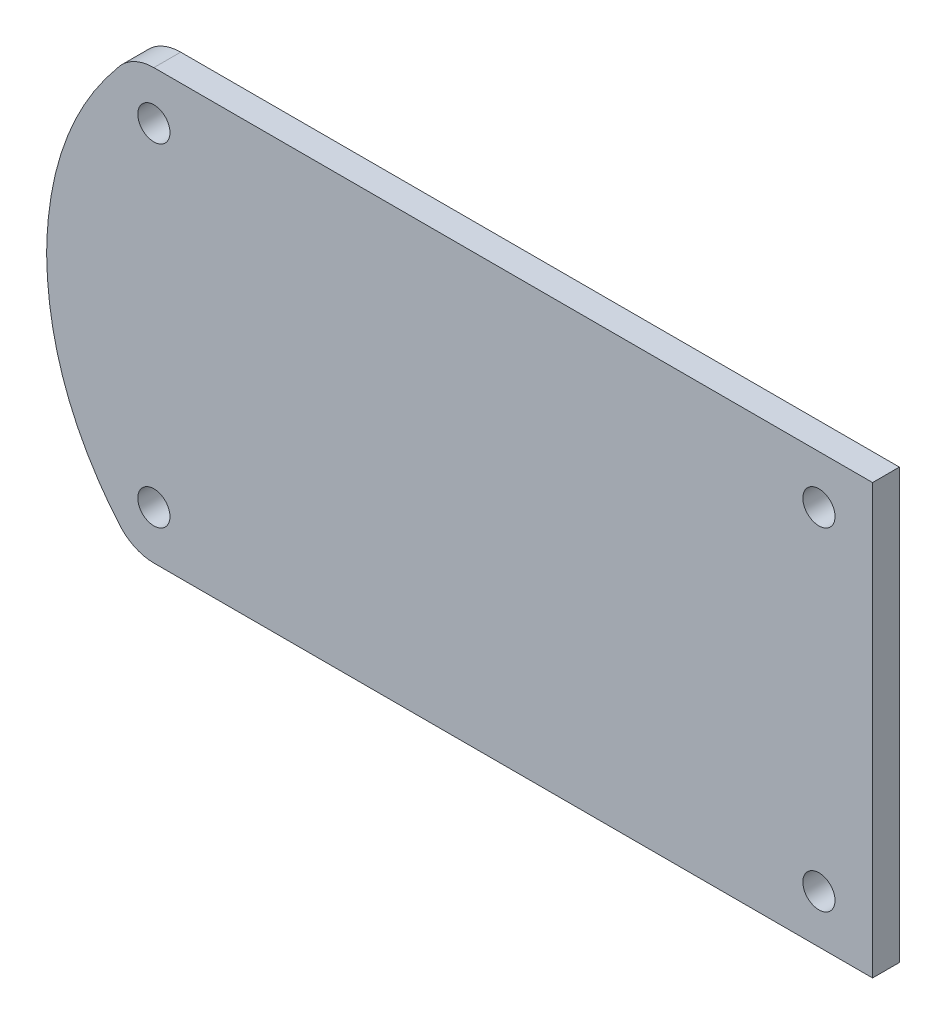
ISO-10303-21;
HEADER;
FILE_DESCRIPTION(('STEP AP214'),'2;1');
FILE_NAME('part.step','',(''),(''),'','','');
FILE_SCHEMA(('AUTOMOTIVE_DESIGN { 1 0 10303 214 1 1 1 1 }'));
ENDSEC;
DATA;
#1=APPLICATION_CONTEXT('core data for automotive mechanical design processes');
#2=APPLICATION_PROTOCOL_DEFINITION('international standard','automotive_design',2000,#1);
#3=PRODUCT_CONTEXT('',#1,'mechanical');
#4=PRODUCT('Part','Part','',(#3));
#5=PRODUCT_RELATED_PRODUCT_CATEGORY('part','',(#4));
#6=PRODUCT_DEFINITION_FORMATION('','',#4);
#7=PRODUCT_DEFINITION_CONTEXT('part definition',#1,'design');
#8=PRODUCT_DEFINITION('design','',#6,#7);
#9=PRODUCT_DEFINITION_SHAPE('','',#8);
#10=(LENGTH_UNIT() NAMED_UNIT(*) SI_UNIT(.MILLI.,.METRE.));
#11=(NAMED_UNIT(*) PLANE_ANGLE_UNIT() SI_UNIT($,.RADIAN.));
#12=(NAMED_UNIT(*) SI_UNIT($,.STERADIAN.) SOLID_ANGLE_UNIT());
#13=UNCERTAINTY_MEASURE_WITH_UNIT(LENGTH_MEASURE(1.E-05),#10,'distance_accuracy_value','');
#14=(GEOMETRIC_REPRESENTATION_CONTEXT(3) GLOBAL_UNCERTAINTY_ASSIGNED_CONTEXT((#13)) GLOBAL_UNIT_ASSIGNED_CONTEXT((#10,
#11,#12)) REPRESENTATION_CONTEXT('',''));
#15=CARTESIAN_POINT('',(0.,0.,0.));
#16=DIRECTION('',(0.,0.,1.));
#17=DIRECTION('',(1.,0.,0.));
#18=AXIS2_PLACEMENT_3D('',#15,#16,#17);
#19=CARTESIAN_POINT('',(-97.318076,15.5,2.5));
#20=DIRECTION('',(0.,0.,-1.));
#21=DIRECTION('',(-1.,0.,0.));
#22=AXIS2_PLACEMENT_3D('',#19,#20,#21);
#23=CYLINDRICAL_SURFACE('',#22,1.5);
#24=CARTESIAN_POINT('',(-97.318076,15.5,2.5));
#25=DIRECTION('',(0.,0.,1.));
#26=DIRECTION('',(1.,0.,0.));
#27=AXIS2_PLACEMENT_3D('',#24,#25,#26);
#28=CIRCLE('',#27,1.5);
#29=CARTESIAN_POINT('',(-95.818076,15.5,2.5));
#30=VERTEX_POINT('',#29);
#31=EDGE_CURVE('E203',#30,#30,#28,.T.);
#32=ORIENTED_EDGE('',*,*,#31,.F.);
#33=EDGE_LOOP('',(#32));
#34=FACE_BOUND('',#33,.T.);
#35=CARTESIAN_POINT('',(-97.318076,15.5,5.));
#36=DIRECTION('',(0.,0.,1.));
#37=DIRECTION('',(1.,0.,0.));
#38=AXIS2_PLACEMENT_3D('',#35,#36,#37);
#39=CIRCLE('',#38,1.5);
#40=CARTESIAN_POINT('',(-95.818076,15.5,5.));
#41=VERTEX_POINT('',#40);
#42=EDGE_CURVE('E197',#41,#41,#39,.T.);
#43=ORIENTED_EDGE('',*,*,#42,.T.);
#44=EDGE_LOOP('',(#43));
#45=FACE_BOUND('',#44,.T.);
#46=ADVANCED_FACE('F33',(#34,#45),#23,.F.);
#47=CARTESIAN_POINT('',(-97.318076,-15.5,2.5));
#48=DIRECTION('',(0.,0.,-1.));
#49=DIRECTION('',(-1.,0.,0.));
#50=AXIS2_PLACEMENT_3D('',#47,#48,#49);
#51=CYLINDRICAL_SURFACE('',#50,1.5);
#52=CARTESIAN_POINT('',(-97.318076,-15.5,2.5));
#53=DIRECTION('',(0.,0.,1.));
#54=DIRECTION('',(1.,0.,0.));
#55=AXIS2_PLACEMENT_3D('',#52,#53,#54);
#56=CIRCLE('',#55,1.5);
#57=CARTESIAN_POINT('',(-95.818076,-15.5,2.5));
#58=VERTEX_POINT('',#57);
#59=EDGE_CURVE('E209',#58,#58,#56,.T.);
#60=ORIENTED_EDGE('',*,*,#59,.F.);
#61=EDGE_LOOP('',(#60));
#62=FACE_BOUND('',#61,.T.);
#63=CARTESIAN_POINT('',(-97.318076,-15.5,5.));
#64=DIRECTION('',(0.,0.,1.));
#65=DIRECTION('',(1.,0.,0.));
#66=AXIS2_PLACEMENT_3D('',#63,#64,#65);
#67=CIRCLE('',#66,1.5);
#68=CARTESIAN_POINT('',(-95.818076,-15.5,5.));
#69=VERTEX_POINT('',#68);
#70=EDGE_CURVE('E194',#69,#69,#67,.T.);
#71=ORIENTED_EDGE('',*,*,#70,.T.);
#72=EDGE_LOOP('',(#71));
#73=FACE_BOUND('',#72,.T.);
#74=ADVANCED_FACE('F234',(#62,#73),#51,.F.);
#75=CARTESIAN_POINT('',(-35.318076,-15.5,2.5));
#76=DIRECTION('',(0.,0.,-1.));
#77=DIRECTION('',(-1.,0.,0.));
#78=AXIS2_PLACEMENT_3D('',#75,#76,#77);
#79=CYLINDRICAL_SURFACE('',#78,1.5);
#80=CARTESIAN_POINT('',(-35.318076,-15.5,2.5));
#81=DIRECTION('',(0.,0.,1.));
#82=DIRECTION('',(1.,0.,0.));
#83=AXIS2_PLACEMENT_3D('',#80,#81,#82);
#84=CIRCLE('',#83,1.5);
#85=CARTESIAN_POINT('',(-33.818076,-15.5,2.5));
#86=VERTEX_POINT('',#85);
#87=EDGE_CURVE('E206',#86,#86,#84,.T.);
#88=ORIENTED_EDGE('',*,*,#87,.F.);
#89=EDGE_LOOP('',(#88));
#90=FACE_BOUND('',#89,.T.);
#91=CARTESIAN_POINT('',(-35.318076,-15.5,5.));
#92=DIRECTION('',(0.,0.,1.));
#93=DIRECTION('',(1.,0.,0.));
#94=AXIS2_PLACEMENT_3D('',#91,#92,#93);
#95=CIRCLE('',#94,1.5);
#96=CARTESIAN_POINT('',(-33.818076,-15.5,5.));
#97=VERTEX_POINT('',#96);
#98=EDGE_CURVE('E191',#97,#97,#95,.T.);
#99=ORIENTED_EDGE('',*,*,#98,.T.);
#100=EDGE_LOOP('',(#99));
#101=FACE_BOUND('',#100,.T.);
#102=ADVANCED_FACE('F240',(#90,#101),#79,.F.);
#103=CARTESIAN_POINT('',(-35.318076,15.5,2.5));
#104=DIRECTION('',(0.,0.,-1.));
#105=DIRECTION('',(-1.,0.,0.));
#106=AXIS2_PLACEMENT_3D('',#103,#104,#105);
#107=CYLINDRICAL_SURFACE('',#106,1.5);
#108=CARTESIAN_POINT('',(-35.318076,15.5,2.5));
#109=DIRECTION('',(0.,0.,1.));
#110=DIRECTION('',(1.,0.,0.));
#111=AXIS2_PLACEMENT_3D('',#108,#109,#110);
#112=CIRCLE('',#111,1.5);
#113=CARTESIAN_POINT('',(-33.818076,15.5,2.5));
#114=VERTEX_POINT('',#113);
#115=EDGE_CURVE('E200',#114,#114,#112,.T.);
#116=ORIENTED_EDGE('',*,*,#115,.F.);
#117=EDGE_LOOP('',(#116));
#118=FACE_BOUND('',#117,.T.);
#119=CARTESIAN_POINT('',(-35.318076,15.5,5.));
#120=DIRECTION('',(0.,0.,1.));
#121=DIRECTION('',(1.,0.,0.));
#122=AXIS2_PLACEMENT_3D('',#119,#120,#121);
#123=CIRCLE('',#122,1.5);
#124=CARTESIAN_POINT('',(-33.818076,15.5,5.));
#125=VERTEX_POINT('',#124);
#126=EDGE_CURVE('E120',#125,#125,#123,.T.);
#127=ORIENTED_EDGE('',*,*,#126,.T.);
#128=EDGE_LOOP('',(#127));
#129=FACE_BOUND('',#128,.T.);
#130=ADVANCED_FACE('F247',(#118,#129),#107,.F.);
#131=CARTESIAN_POINT('',(-105.585487469088,9.87324476663704,5.));
#132=DIRECTION('',(0.,0.,-1.));
#133=DIRECTION('',(-1.,0.,0.));
#134=AXIS2_PLACEMENT_3D('',#131,#132,#133);
#135=PLANE('',#134);
#136=CARTESIAN_POINT('',(-100.681450854734,18.3128091627008,5.));
#137=CARTESIAN_POINT('',(-100.870789186462,18.0858267021105,5.));
#138=CARTESIAN_POINT('',(-101.056898330984,17.8561426515609,5.));
#139=CARTESIAN_POINT('',(-101.422343146205,17.3914599273219,5.));
#140=CARTESIAN_POINT('',(-101.60167901688,17.1564614108661,5.));
#141=CARTESIAN_POINT('',(-101.953264257242,16.6812372605601,5.));
#142=CARTESIAN_POINT('',(-102.125513995416,16.4410118995075,5.));
#143=CARTESIAN_POINT('',(-102.462826956648,15.9551650667716,5.));
#144=CARTESIAN_POINT('',(-102.627881860731,15.7095378181518,5.));
#145=CARTESIAN_POINT('',(-102.95032039302,15.2132745780676,5.));
#146=CARTESIAN_POINT('',(-103.107703591382,14.962638307056,5.));
#147=CARTESIAN_POINT('',(-103.414542021274,14.4565040537915,5.));
#148=CARTESIAN_POINT('',(-103.563995775412,14.2010051775166,5.));
#149=CARTESIAN_POINT('',(-103.96193645338,13.4951517204798,5.));
#150=CARTESIAN_POINT('',(-104.202148866189,13.0400924376787,5.));
#151=CARTESIAN_POINT('',(-104.656707316303,12.1170698772328,5.));
#152=CARTESIAN_POINT('',(-104.871044902941,11.6491024447846,5.));
#153=CARTESIAN_POINT('',(-105.2729519373,10.7017518321381,5.));
#154=CARTESIAN_POINT('',(-105.460518901434,10.2223675975778,5.));
#155=CARTESIAN_POINT('',(-105.808423036383,9.25354033311596,5.));
#156=CARTESIAN_POINT('',(-105.968745967357,8.76409219193787,5.));
#157=CARTESIAN_POINT('',(-106.261845933766,7.77708277127068,5.));
#158=CARTESIAN_POINT('',(-106.394625632942,7.27952228136169,5.));
#159=CARTESIAN_POINT('',(-106.632780406481,6.27802814377956,5.));
#160=CARTESIAN_POINT('',(-106.738163443895,5.77409639271942,5.));
#161=CARTESIAN_POINT('',(-106.882744142437,4.97780668338872,5.));
#162=CARTESIAN_POINT('',(-106.930981225642,4.68705557390813,5.));
#163=CARTESIAN_POINT('',(-107.018762994303,4.10429383127697,5.));
#164=CARTESIAN_POINT('',(-107.05830932512,3.81228344722874,5.));
#165=CARTESIAN_POINT('',(-107.128868747446,3.22725298002231,5.));
#166=CARTESIAN_POINT('',(-107.159882278077,2.93423294960961,5.));
#167=CARTESIAN_POINT('',(-107.21348517004,2.34819087026898,5.));
#168=CARTESIAN_POINT('',(-107.236096169696,2.05517079728734,5.));
#169=CARTESIAN_POINT('',(-107.273199079658,1.46860692399145,5.));
#170=CARTESIAN_POINT('',(-107.287690629268,1.17506310099125,5.));
#171=CARTESIAN_POINT('',(-107.308763366221,0.587689327445185,5.));
#172=CARTESIAN_POINT('',(-107.315344517155,0.293859375588569,5.));
#173=CARTESIAN_POINT('',(-107.318075539762,2.08537943857667E-08,5.));
#174=B_SPLINE_CURVE_WITH_KNOTS('',3,(#136,#137,#138,#139,#140,#141,#142,#143,#144,#145,#146,
#147,#148,#149,#150,#151,#152,#153,#154,#155,#156,#157,#158,#159,#160,#161,#162,#163,#164,#165,
#166,#167,#168,#169,#170,#171,#172,#173),.UNSPECIFIED.,.F.,.F.,(4,2,2,2,2,2,2,2,2,2,2,2,2,2,2,2,
2,2,4),(0.,0.886731758999808,1.77343731743761,2.66009670773982,3.54775547949163,4.4354639294691,
5.32333719810382,6.86618254928342,8.40953043518403,9.95302140897279,11.4973166656635,
13.0414625019152,14.5851590171822,15.4692212897518,16.3531160443536,17.236965302588,
18.1185224211475,19.00011869872,19.8817190340287),.UNSPECIFIED.);
#175=CARTESIAN_POINT('',(-100.681450854734,18.3128091627008,5.));
#176=VERTEX_POINT('',#175);
#177=CARTESIAN_POINT('',(-107.318075539762,2.08537943857667E-08,5.));
#178=VERTEX_POINT('',#177);
#179=EDGE_CURVE('E122',#176,#178,#174,.T.);
#180=ORIENTED_EDGE('',*,*,#179,.T.);
#181=CARTESIAN_POINT('',(-107.318075539762,2.08537943857667E-08,5.));
#182=CARTESIAN_POINT('',(-107.315332687031,-0.295135445910952,5.));
#183=CARTESIAN_POINT('',(-107.308706153645,-0.59024130755669,5.));
#184=CARTESIAN_POINT('',(-107.287472928933,-1.18016178476504,5.));
#185=CARTESIAN_POINT('',(-107.272866319094,-1.47497640327083,5.));
#186=CARTESIAN_POINT('',(-107.235460990669,-2.06407432901319,5.));
#187=CARTESIAN_POINT('',(-107.212662663315,-2.35835766094936,5.));
#188=CARTESIAN_POINT('',(-107.158606761002,-2.94695404387085,5.));
#189=CARTESIAN_POINT('',(-107.127326367714,-3.2412650026399,5.));
#190=CARTESIAN_POINT('',(-107.056154023444,-3.82886463012549,5.));
#191=CARTESIAN_POINT('',(-107.016261597862,-4.12215324159599,5.));
#192=CARTESIAN_POINT('',(-106.927706691983,-4.70745579330977,5.));
#193=CARTESIAN_POINT('',(-106.879042477397,-4.99946946976828,5.));
#194=CARTESIAN_POINT('',(-106.731899727133,-5.80619307059645,5.));
#195=CARTESIAN_POINT('',(-106.623921212057,-6.31920774963436,5.));
#196=CARTESIAN_POINT('',(-106.379551499822,-7.33858006587585,5.));
#197=CARTESIAN_POINT('',(-106.243151590276,-7.84493561104827,5.));
#198=CARTESIAN_POINT('',(-105.941793128264,-8.84914832291266,5.));
#199=CARTESIAN_POINT('',(-105.776831645521,-9.3470046118595,5.));
#200=CARTESIAN_POINT('',(-105.418678586608,-10.3321345642429,5.));
#201=CARTESIAN_POINT('',(-105.225503442824,-10.8194141993342,5.));
#202=CARTESIAN_POINT('',(-104.811459113146,-11.7819953494822,5.));
#203=CARTESIAN_POINT('',(-104.590592677729,-12.2572980485419,5.));
#204=CARTESIAN_POINT('',(-104.122139425587,-13.1943618450038,5.));
#205=CARTESIAN_POINT('',(-103.874562090491,-13.6561276740825,5.));
#206=CARTESIAN_POINT('',(-103.472419575556,-14.3580843385405,5.));
#207=CARTESIAN_POINT('',(-103.326814601078,-14.6034556237344,5.));
#208=CARTESIAN_POINT('',(-103.02828298465,-15.0896445659103,5.));
#209=CARTESIAN_POINT('',(-102.875357815414,-15.3304631253463,5.));
#210=CARTESIAN_POINT('',(-102.562419106434,-15.807422156841,5.));
#211=CARTESIAN_POINT('',(-102.402406040909,-16.0435629403443,5.));
#212=CARTESIAN_POINT('',(-102.075751166218,-16.5107607873915,5.));
#213=CARTESIAN_POINT('',(-101.909118158749,-16.7418240060204,5.));
#214=CARTESIAN_POINT('',(-101.569289306437,-17.1990921881423,5.));
#215=CARTESIAN_POINT('',(-101.396093053938,-17.425296848489,5.));
#216=CARTESIAN_POINT('',(-101.043414863795,-17.8727738457592,5.));
#217=CARTESIAN_POINT('',(-100.863932568082,-18.0940459005291,5.));
#218=CARTESIAN_POINT('',(-100.681450854734,-18.3128091209932,5.));
#219=B_SPLINE_CURVE_WITH_KNOTS('',3,(#181,#182,#183,#184,#185,#186,#187,#188,#189,#190,#191,
#192,#193,#194,#195,#196,#197,#198,#199,#200,#201,#202,#203,#204,#205,#206,#207,#208,#209,#210,
#211,#212,#213,#214,#215,#216,#217,#218),.UNSPECIFIED.,.F.,.F.,(4,2,2,2,2,2,2,2,2,2,2,2,2,2,2,2,
2,2,4),(0.,0.885428666062189,1.77084829088553,2.65622563395354,3.54400885030045,
4.43184100398926,5.31984888573627,6.89176538381014,8.4641644530803,10.0367249384541,
11.6083731484342,13.1798653756929,14.7508015907339,15.6066527237121,16.4623323900041,
17.3179548926428,18.1724755450482,19.0270493606718,19.8816719345906),.UNSPECIFIED.);
#220=CARTESIAN_POINT('',(-100.681450854734,-18.3128091209932,5.));
#221=VERTEX_POINT('',#220);
#222=EDGE_CURVE('E132',#178,#221,#219,.T.);
#223=ORIENTED_EDGE('',*,*,#222,.T.);
#224=CARTESIAN_POINT('',(-97.3180760101842,-15.8039999791462,5.));
#225=DIRECTION('',(0.,0.,1.));
#226=DIRECTION('',(1.,0.,0.));
#227=AXIS2_PLACEMENT_3D('',#224,#225,#226);
#228=CIRCLE('',#227,4.19599972058711);
#229=CARTESIAN_POINT('',(-97.3180760101842,-19.9999996997333,5.));
#230=VERTEX_POINT('',#229);
#231=EDGE_CURVE('E186',#221,#230,#228,.T.);
#232=ORIENTED_EDGE('',*,*,#231,.T.);
#233=DIRECTION('',(1.,0.,0.));
#234=VECTOR('',#233,1.);
#235=CARTESIAN_POINT('',(-97.3180760101842,-19.9999996997333,5.));
#236=LINE('',#235,#234);
#237=CARTESIAN_POINT('',(-30.318076,-19.9999996997333,5.));
#238=VERTEX_POINT('',#237);
#239=EDGE_CURVE('E100',#230,#238,#236,.T.);
#240=ORIENTED_EDGE('',*,*,#239,.T.);
#241=DIRECTION('',(0.,1.,0.));
#242=VECTOR('',#241,1.);
#243=CARTESIAN_POINT('',(-30.318076,20.0000000208538,5.));
#244=LINE('',#243,#242);
#245=CARTESIAN_POINT('',(-30.318076,20.0000000208538,5.));
#246=VERTEX_POINT('',#245);
#247=EDGE_CURVE('E92',#238,#246,#244,.T.);
#248=ORIENTED_EDGE('',*,*,#247,.T.);
#249=DIRECTION('',(-1.,0.,0.));
#250=VECTOR('',#249,1.);
#251=CARTESIAN_POINT('',(-50.1355000101842,20.0000000208538,5.));
#252=LINE('',#251,#250);
#253=CARTESIAN_POINT('',(-97.3180760101842,20.0000000208538,5.));
#254=VERTEX_POINT('',#253);
#255=EDGE_CURVE('E98',#246,#254,#252,.T.);
#256=ORIENTED_EDGE('',*,*,#255,.T.);
#257=CARTESIAN_POINT('',(-97.3180758017646,15.8040003002667,5.));
#258=DIRECTION('',(0.,0.,1.));
#259=DIRECTION('',(1.,0.,0.));
#260=AXIS2_PLACEMENT_3D('',#257,#258,#259);
#261=CIRCLE('',#260,4.19599972058711);
#262=EDGE_CURVE('E111',#254,#176,#261,.T.);
#263=ORIENTED_EDGE('',*,*,#262,.T.);
#264=EDGE_LOOP('',(#180,#223,#232,#240,#248,#256,#263));
#265=FACE_BOUND('',#264,.T.);
#266=ORIENTED_EDGE('',*,*,#126,.F.);
#267=EDGE_LOOP('',(#266));
#268=FACE_BOUND('',#267,.T.);
#269=ORIENTED_EDGE('',*,*,#98,.F.);
#270=EDGE_LOOP('',(#269));
#271=FACE_BOUND('',#270,.T.);
#272=ORIENTED_EDGE('',*,*,#70,.F.);
#273=EDGE_LOOP('',(#272));
#274=FACE_BOUND('',#273,.T.);
#275=ORIENTED_EDGE('',*,*,#42,.F.);
#276=EDGE_LOOP('',(#275));
#277=FACE_BOUND('',#276,.T.);
#278=ADVANCED_FACE('F95',(#265,#268,#271,#274,#277),#135,.F.);
#279=CARTESIAN_POINT('',(-30.318076,20.0000000208538,5.));
#280=DIRECTION('',(-1.,0.,0.));
#281=DIRECTION('',(0.,-1.,0.));
#282=AXIS2_PLACEMENT_3D('',#279,#280,#281);
#283=PLANE('',#282);
#284=DIRECTION('',(0.,1.,0.));
#285=VECTOR('',#284,1.);
#286=CARTESIAN_POINT('',(-30.318076,20.0000000208538,2.5));
#287=LINE('',#286,#285);
#288=CARTESIAN_POINT('',(-30.318076,-19.9999996997333,2.5));
#289=VERTEX_POINT('',#288);
#290=CARTESIAN_POINT('',(-30.318076,20.0000000208538,2.5));
#291=VERTEX_POINT('',#290);
#292=EDGE_CURVE('E108',#289,#291,#287,.T.);
#293=ORIENTED_EDGE('',*,*,#292,.T.);
#294=DIRECTION('',(0.,0.,-1.));
#295=VECTOR('',#294,1.);
#296=CARTESIAN_POINT('',(-30.318076,20.0000000208538,5.));
#297=LINE('',#296,#295);
#298=EDGE_CURVE('E106',#246,#291,#297,.T.);
#299=ORIENTED_EDGE('',*,*,#298,.F.);
#300=ORIENTED_EDGE('',*,*,#247,.F.);
#301=DIRECTION('',(0.,0.,-1.));
#302=VECTOR('',#301,1.);
#303=CARTESIAN_POINT('',(-30.318076,-19.9999996997333,5.));
#304=LINE('',#303,#302);
#305=EDGE_CURVE('E110',#238,#289,#304,.T.);
#306=ORIENTED_EDGE('',*,*,#305,.T.);
#307=EDGE_LOOP('',(#293,#299,#300,#306));
#308=FACE_BOUND('',#307,.T.);
#309=ADVANCED_FACE('F107',(#308),#283,.F.);
#310=CARTESIAN_POINT('',(-97.3180760101842,-19.9999996997333,2.5));
#311=DIRECTION('',(0.,1.,0.));
#312=DIRECTION('',(0.,0.,1.));
#313=AXIS2_PLACEMENT_3D('',#310,#311,#312);
#314=PLANE('',#313);
#315=DIRECTION('',(0.,0.,-1.));
#316=VECTOR('',#315,1.);
#317=CARTESIAN_POINT('',(-97.3180760101842,-19.9999996997333,2.5));
#318=LINE('',#317,#316);
#319=CARTESIAN_POINT('',(-97.3180760101842,-19.9999996997333,2.5));
#320=VERTEX_POINT('',#319);
#321=EDGE_CURVE('E82',#230,#320,#318,.T.);
#322=ORIENTED_EDGE('',*,*,#321,.T.);
#323=DIRECTION('',(1.,0.,0.));
#324=VECTOR('',#323,1.);
#325=CARTESIAN_POINT('',(-30.318076,-19.9999996997333,2.5));
#326=LINE('',#325,#324);
#327=EDGE_CURVE('E117',#320,#289,#326,.T.);
#328=ORIENTED_EDGE('',*,*,#327,.T.);
#329=ORIENTED_EDGE('',*,*,#305,.F.);
#330=ORIENTED_EDGE('',*,*,#239,.F.);
#331=EDGE_LOOP('',(#322,#328,#329,#330));
#332=FACE_BOUND('',#331,.T.);
#333=ADVANCED_FACE('F185',(#332),#314,.F.);
#334=CARTESIAN_POINT('',(-97.3180760101842,-15.8039999791462,2.5));
#335=DIRECTION('',(0.,0.,-1.));
#336=DIRECTION('',(-1.,0.,0.));
#337=AXIS2_PLACEMENT_3D('',#334,#335,#336);
#338=CYLINDRICAL_SURFACE('',#337,4.19599972058711);
#339=DIRECTION('',(0.,0.,-1.));
#340=VECTOR('',#339,1.);
#341=CARTESIAN_POINT('',(-100.681450854734,-18.3128091209932,2.5));
#342=LINE('',#341,#340);
#343=CARTESIAN_POINT('',(-100.681450854734,-18.3128091209932,2.5));
#344=VERTEX_POINT('',#343);
#345=EDGE_CURVE('E73',#221,#344,#342,.T.);
#346=ORIENTED_EDGE('',*,*,#345,.T.);
#347=CARTESIAN_POINT('',(-97.3180760101842,-15.8039999791462,2.5));
#348=DIRECTION('',(0.,0.,1.));
#349=DIRECTION('',(1.,0.,0.));
#350=AXIS2_PLACEMENT_3D('',#347,#348,#349);
#351=CIRCLE('',#350,4.19599972058711);
#352=EDGE_CURVE('E224',#344,#320,#351,.T.);
#353=ORIENTED_EDGE('',*,*,#352,.T.);
#354=ORIENTED_EDGE('',*,*,#321,.F.);
#355=ORIENTED_EDGE('',*,*,#231,.F.);
#356=EDGE_LOOP('',(#346,#353,#354,#355));
#357=FACE_BOUND('',#356,.T.);
#358=ADVANCED_FACE('F228',(#357),#338,.T.);
#359=CARTESIAN_POINT('',(-107.318075539762,2.08537943857667E-08,2.5));
#360=CARTESIAN_POINT('',(-107.252414123283,-7.05974390246724,2.5));
#361=CARTESIAN_POINT('',(-104.975710329453,-13.1646389972982,2.5));
#362=CARTESIAN_POINT('',(-100.681450854734,-18.3128091209932,2.5));
#363=B_SPLINE_CURVE_WITH_KNOTS('',3,(#359,#360,#361,#362),.UNSPECIFIED.,.F.,.F.,(4,4),(0.,1.),.UNSPECIFIED.);
#364=DIRECTION('',(0.,0.,-1.));
#365=VECTOR('',#364,1.);
#366=SURFACE_OF_LINEAR_EXTRUSION('',#363,#365);
#367=DIRECTION('',(0.,0.,-1.));
#368=VECTOR('',#367,1.);
#369=CARTESIAN_POINT('',(-107.318075539762,2.08537943857667E-08,2.5));
#370=LINE('',#369,#368);
#371=CARTESIAN_POINT('',(-107.318075539762,2.08537943857667E-08,2.5));
#372=VERTEX_POINT('',#371);
#373=EDGE_CURVE('E165',#178,#372,#370,.T.);
#374=ORIENTED_EDGE('',*,*,#373,.T.);
#375=CARTESIAN_POINT('',(-107.318075539762,2.08537943857667E-08,2.5));
#376=CARTESIAN_POINT('',(-107.252414123283,-7.05974390246724,2.5));
#377=CARTESIAN_POINT('',(-104.975710329453,-13.1646389972982,2.5));
#378=CARTESIAN_POINT('',(-100.681450854734,-18.3128091209932,2.5));
#379=B_SPLINE_CURVE_WITH_KNOTS('',3,(#375,#376,#377,#378),.UNSPECIFIED.,.F.,.F.,(4,4),(0.,1.),.UNSPECIFIED.);
#380=EDGE_CURVE('E217',#372,#344,#379,.T.);
#381=ORIENTED_EDGE('',*,*,#380,.T.);
#382=ORIENTED_EDGE('',*,*,#345,.F.);
#383=ORIENTED_EDGE('',*,*,#222,.F.);
#384=EDGE_LOOP('',(#374,#381,#382,#383));
#385=FACE_BOUND('',#384,.T.);
#386=ADVANCED_FACE('F145',(#385),#366,.F.);
#387=CARTESIAN_POINT('',(-100.681450854734,18.3128091627008,2.5));
#388=CARTESIAN_POINT('',(-104.975710329453,13.1646390390057,2.5));
#389=CARTESIAN_POINT('',(-107.252414123283,7.05974394417483,2.5));
#390=CARTESIAN_POINT('',(-107.318075539762,2.08537943857667E-08,2.5));
#391=B_SPLINE_CURVE_WITH_KNOTS('',3,(#387,#388,#389,#390),.UNSPECIFIED.,.F.,.F.,(4,4),(0.,1.),.UNSPECIFIED.);
#392=DIRECTION('',(0.,0.,-1.));
#393=VECTOR('',#392,1.);
#394=SURFACE_OF_LINEAR_EXTRUSION('',#391,#393);
#395=DIRECTION('',(0.,0.,-1.));
#396=VECTOR('',#395,1.);
#397=CARTESIAN_POINT('',(-100.681450854734,18.3128091627008,2.5));
#398=LINE('',#397,#396);
#399=CARTESIAN_POINT('',(-100.681450854734,18.3128091627008,2.5));
#400=VERTEX_POINT('',#399);
#401=EDGE_CURVE('E41',#176,#400,#398,.T.);
#402=ORIENTED_EDGE('',*,*,#401,.T.);
#403=CARTESIAN_POINT('',(-100.681450854734,18.3128091627008,2.5));
#404=CARTESIAN_POINT('',(-104.975710329453,13.1646390390057,2.5));
#405=CARTESIAN_POINT('',(-107.252414123283,7.05974394417483,2.5));
#406=CARTESIAN_POINT('',(-107.318075539762,2.08537943857667E-08,2.5));
#407=B_SPLINE_CURVE_WITH_KNOTS('',3,(#403,#404,#405,#406),.UNSPECIFIED.,.F.,.F.,(4,4),(0.,1.),.UNSPECIFIED.);
#408=EDGE_CURVE('E172',#400,#372,#407,.T.);
#409=ORIENTED_EDGE('',*,*,#408,.T.);
#410=ORIENTED_EDGE('',*,*,#373,.F.);
#411=ORIENTED_EDGE('',*,*,#179,.F.);
#412=EDGE_LOOP('',(#402,#409,#410,#411));
#413=FACE_BOUND('',#412,.T.);
#414=ADVANCED_FACE('F141',(#413),#394,.F.);
#415=CARTESIAN_POINT('',(-97.3180758017646,15.8040003002667,2.5));
#416=DIRECTION('',(0.,0.,-1.));
#417=DIRECTION('',(-1.,0.,0.));
#418=AXIS2_PLACEMENT_3D('',#415,#416,#417);
#419=CYLINDRICAL_SURFACE('',#418,4.19599972058711);
#420=DIRECTION('',(0.,0.,-1.));
#421=VECTOR('',#420,1.);
#422=CARTESIAN_POINT('',(-97.3180760101842,20.0000000208538,2.5));
#423=LINE('',#422,#421);
#424=CARTESIAN_POINT('',(-97.3180760101842,20.0000000208538,2.5));
#425=VERTEX_POINT('',#424);
#426=EDGE_CURVE('E11',#254,#425,#423,.T.);
#427=ORIENTED_EDGE('',*,*,#426,.T.);
#428=CARTESIAN_POINT('',(-97.3180758017646,15.8040003002667,2.5));
#429=DIRECTION('',(0.,0.,1.));
#430=DIRECTION('',(1.,0.,0.));
#431=AXIS2_PLACEMENT_3D('',#428,#429,#430);
#432=CIRCLE('',#431,4.19599972058711);
#433=EDGE_CURVE('E212',#425,#400,#432,.T.);
#434=ORIENTED_EDGE('',*,*,#433,.T.);
#435=ORIENTED_EDGE('',*,*,#401,.F.);
#436=ORIENTED_EDGE('',*,*,#262,.F.);
#437=EDGE_LOOP('',(#427,#434,#435,#436));
#438=FACE_BOUND('',#437,.T.);
#439=ADVANCED_FACE('F144',(#438),#419,.T.);
#440=CARTESIAN_POINT('',(-97.3180760101842,20.0000000208538,2.5));
#441=DIRECTION('',(0.,-1.,0.));
#442=DIRECTION('',(0.,0.,-1.));
#443=AXIS2_PLACEMENT_3D('',#440,#441,#442);
#444=PLANE('',#443);
#445=DIRECTION('',(-1.,0.,0.));
#446=VECTOR('',#445,1.);
#447=CARTESIAN_POINT('',(-50.1355000101842,20.0000000208538,2.5));
#448=LINE('',#447,#446);
#449=EDGE_CURVE('E48',#291,#425,#448,.T.);
#450=ORIENTED_EDGE('',*,*,#449,.T.);
#451=ORIENTED_EDGE('',*,*,#426,.F.);
#452=ORIENTED_EDGE('',*,*,#255,.F.);
#453=ORIENTED_EDGE('',*,*,#298,.T.);
#454=EDGE_LOOP('',(#450,#451,#452,#453));
#455=FACE_BOUND('',#454,.T.);
#456=ADVANCED_FACE('F35',(#455),#444,.F.);
#457=CARTESIAN_POINT('',(-105.585487469088,9.87324476663704,2.5));
#458=DIRECTION('',(0.,0.,-1.));
#459=DIRECTION('',(-1.,0.,0.));
#460=AXIS2_PLACEMENT_3D('',#457,#458,#459);
#461=PLANE('',#460);
#462=ORIENTED_EDGE('',*,*,#115,.T.);
#463=EDGE_LOOP('',(#462));
#464=FACE_BOUND('',#463,.T.);
#465=ORIENTED_EDGE('',*,*,#31,.T.);
#466=EDGE_LOOP('',(#465));
#467=FACE_BOUND('',#466,.T.);
#468=ORIENTED_EDGE('',*,*,#87,.T.);
#469=EDGE_LOOP('',(#468));
#470=FACE_BOUND('',#469,.T.);
#471=ORIENTED_EDGE('',*,*,#59,.T.);
#472=EDGE_LOOP('',(#471));
#473=FACE_BOUND('',#472,.T.);
#474=ORIENTED_EDGE('',*,*,#292,.F.);
#475=ORIENTED_EDGE('',*,*,#327,.F.);
#476=ORIENTED_EDGE('',*,*,#352,.F.);
#477=ORIENTED_EDGE('',*,*,#380,.F.);
#478=ORIENTED_EDGE('',*,*,#408,.F.);
#479=ORIENTED_EDGE('',*,*,#433,.F.);
#480=ORIENTED_EDGE('',*,*,#449,.F.);
#481=EDGE_LOOP('',(#474,#475,#476,#477,#478,#479,#480));
#482=FACE_BOUND('',#481,.T.);
#483=ADVANCED_FACE('F183',(#464,#467,#470,#473,#482),#461,.T.);
#484=CLOSED_SHELL('',(#46,#74,#102,#130,#278,#309,#333,#358,#386,#414,#439,#456,#483));
#485=MANIFOLD_SOLID_BREP('B2',#484);
#486=ADVANCED_BREP_SHAPE_REPRESENTATION('',(#18,#485),#14);
#487=SHAPE_DEFINITION_REPRESENTATION(#9,#486);
ENDSEC;
END-ISO-10303-21;
